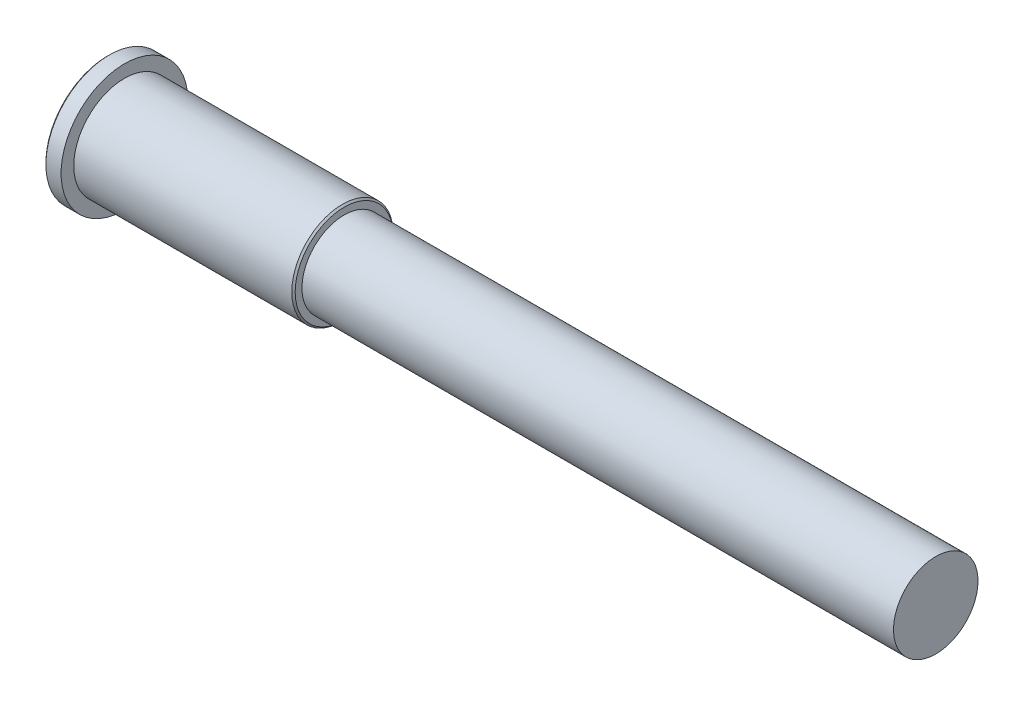
ISO-10303-21;
HEADER;
FILE_DESCRIPTION(('STEP AP214'),'2;1');
FILE_NAME('part.step','',(''),(''),'','','');
FILE_SCHEMA(('AUTOMOTIVE_DESIGN { 1 0 10303 214 1 1 1 1 }'));
ENDSEC;
DATA;
#1=APPLICATION_CONTEXT('core data for automotive mechanical design processes');
#2=APPLICATION_PROTOCOL_DEFINITION('international standard','automotive_design',2000,#1);
#3=PRODUCT_CONTEXT('',#1,'mechanical');
#4=PRODUCT('Part','Part','',(#3));
#5=PRODUCT_RELATED_PRODUCT_CATEGORY('part','',(#4));
#6=PRODUCT_DEFINITION_FORMATION('','',#4);
#7=PRODUCT_DEFINITION_CONTEXT('part definition',#1,'design');
#8=PRODUCT_DEFINITION('design','',#6,#7);
#9=PRODUCT_DEFINITION_SHAPE('','',#8);
#10=(LENGTH_UNIT() NAMED_UNIT(*) SI_UNIT(.MILLI.,.METRE.));
#11=(NAMED_UNIT(*) PLANE_ANGLE_UNIT() SI_UNIT($,.RADIAN.));
#12=(NAMED_UNIT(*) SI_UNIT($,.STERADIAN.) SOLID_ANGLE_UNIT());
#13=UNCERTAINTY_MEASURE_WITH_UNIT(LENGTH_MEASURE(1.E-05),#10,'distance_accuracy_value','');
#14=(GEOMETRIC_REPRESENTATION_CONTEXT(3) GLOBAL_UNCERTAINTY_ASSIGNED_CONTEXT((#13)) GLOBAL_UNIT_ASSIGNED_CONTEXT((#10,
#11,#12)) REPRESENTATION_CONTEXT('',''));
#15=CARTESIAN_POINT('',(0.,0.,0.));
#16=DIRECTION('',(0.,0.,1.));
#17=DIRECTION('',(1.,0.,0.));
#18=AXIS2_PLACEMENT_3D('',#15,#16,#17);
#19=CARTESIAN_POINT('',(2.,0.,0.));
#20=DIRECTION('',(-1.,0.,0.));
#21=DIRECTION('',(0.,0.,1.));
#22=AXIS2_PLACEMENT_3D('',#19,#20,#21);
#23=CYLINDRICAL_SURFACE('',#22,7.5);
#24=CARTESIAN_POINT('',(0.2,0.,0.));
#25=DIRECTION('',(1.,0.,0.));
#26=DIRECTION('',(0.,0.,-1.));
#27=AXIS2_PLACEMENT_3D('',#24,#25,#26);
#28=CIRCLE('',#27,7.5);
#29=CARTESIAN_POINT('',(0.2,0.,-7.5));
#30=VERTEX_POINT('',#29);
#31=EDGE_CURVE('E52',#30,#30,#28,.T.);
#32=ORIENTED_EDGE('',*,*,#31,.T.);
#33=EDGE_LOOP('',(#32));
#34=FACE_BOUND('',#33,.T.);
#35=CARTESIAN_POINT('',(2.,0.,0.));
#36=DIRECTION('',(1.,0.,0.));
#37=DIRECTION('',(0.,0.,-1.));
#38=AXIS2_PLACEMENT_3D('',#35,#36,#37);
#39=CIRCLE('',#38,7.5);
#40=CARTESIAN_POINT('',(2.,0.,-7.5));
#41=VERTEX_POINT('',#40);
#42=EDGE_CURVE('E58',#41,#41,#39,.T.);
#43=ORIENTED_EDGE('',*,*,#42,.F.);
#44=EDGE_LOOP('',(#43));
#45=FACE_BOUND('',#44,.T.);
#46=ADVANCED_FACE('F36',(#34,#45),#23,.T.);
#47=CARTESIAN_POINT('',(2.,0.,0.));
#48=DIRECTION('',(1.,0.,0.));
#49=DIRECTION('',(0.,0.,-1.));
#50=AXIS2_PLACEMENT_3D('',#47,#48,#49);
#51=PLANE('',#50);
#52=CARTESIAN_POINT('',(2.,0.,0.));
#53=DIRECTION('',(1.,0.,0.));
#54=DIRECTION('',(0.,0.,-1.));
#55=AXIS2_PLACEMENT_3D('',#52,#53,#54);
#56=CIRCLE('',#55,6.);
#57=CARTESIAN_POINT('',(2.,0.,6.));
#58=VERTEX_POINT('',#57);
#59=EDGE_CURVE('E61',#58,#58,#56,.T.);
#60=ORIENTED_EDGE('',*,*,#59,.F.);
#61=EDGE_LOOP('',(#60));
#62=FACE_BOUND('',#61,.T.);
#63=ORIENTED_EDGE('',*,*,#42,.T.);
#64=EDGE_LOOP('',(#63));
#65=FACE_BOUND('',#64,.T.);
#66=ADVANCED_FACE('F88',(#62,#65),#51,.T.);
#67=CARTESIAN_POINT('',(0.,0.,0.));
#68=DIRECTION('',(1.,0.,0.));
#69=DIRECTION('',(0.,0.,-1.));
#70=AXIS2_PLACEMENT_3D('',#67,#68,#69);
#71=PLANE('',#70);
#72=CARTESIAN_POINT('',(0.,0.,0.));
#73=DIRECTION('',(1.,0.,0.));
#74=DIRECTION('',(0.,0.,-1.));
#75=AXIS2_PLACEMENT_3D('',#72,#73,#74);
#76=CIRCLE('',#75,7.3);
#77=CARTESIAN_POINT('',(0.,0.,-7.3));
#78=VERTEX_POINT('',#77);
#79=EDGE_CURVE('E48',#78,#78,#76,.F.);
#80=ORIENTED_EDGE('',*,*,#79,.T.);
#81=EDGE_LOOP('',(#80));
#82=FACE_BOUND('',#81,.T.);
#83=ADVANCED_FACE('F85',(#82),#71,.F.);
#84=CARTESIAN_POINT('',(28.,0.,0.));
#85=DIRECTION('',(-1.,0.,0.));
#86=DIRECTION('',(0.,0.,1.));
#87=AXIS2_PLACEMENT_3D('',#84,#85,#86);
#88=CYLINDRICAL_SURFACE('',#87,6.);
#89=CARTESIAN_POINT('',(27.8000000000001,0.,0.));
#90=DIRECTION('',(1.,0.,0.));
#91=DIRECTION('',(0.,0.,-1.));
#92=AXIS2_PLACEMENT_3D('',#89,#90,#91);
#93=CIRCLE('',#92,6.);
#94=CARTESIAN_POINT('',(27.8000000000001,0.,6.));
#95=VERTEX_POINT('',#94);
#96=EDGE_CURVE('E10',#95,#95,#93,.F.);
#97=CARTESIAN_POINT('',(27.8000000000001,0.,6.));
#98=CARTESIAN_POINT('',(27.5312500000001,0.,6.));
#99=CARTESIAN_POINT('',(27.2625000000001,0.,6.));
#100=CARTESIAN_POINT('',(26.7250000000001,0.,6.));
#101=CARTESIAN_POINT('',(26.4562500000001,0.,6.));
#102=CARTESIAN_POINT('',(25.9187500000001,0.,6.));
#103=CARTESIAN_POINT('',(25.6500000000001,0.,6.));
#104=CARTESIAN_POINT('',(25.1125000000001,0.,6.));
#105=CARTESIAN_POINT('',(24.8437500000001,0.,6.));
#106=CARTESIAN_POINT('',(24.3062500000001,0.,6.));
#107=CARTESIAN_POINT('',(24.0375000000001,0.,6.));
#108=CARTESIAN_POINT('',(23.5000000000001,0.,6.));
#109=CARTESIAN_POINT('',(23.2312500000001,0.,6.));
#110=CARTESIAN_POINT('',(22.6937500000001,0.,6.));
#111=CARTESIAN_POINT('',(22.4250000000001,0.,6.));
#112=CARTESIAN_POINT('',(21.8875000000001,0.,6.));
#113=CARTESIAN_POINT('',(21.6187500000001,0.,6.));
#114=CARTESIAN_POINT('',(21.0812500000001,0.,6.));
#115=CARTESIAN_POINT('',(20.8125000000001,0.,6.));
#116=CARTESIAN_POINT('',(20.275,0.,6.));
#117=CARTESIAN_POINT('',(20.0062500000001,0.,6.));
#118=CARTESIAN_POINT('',(19.46875,0.,6.));
#119=CARTESIAN_POINT('',(19.2,0.,6.));
#120=CARTESIAN_POINT('',(18.6625,0.,6.));
#121=CARTESIAN_POINT('',(18.39375,0.,6.));
#122=CARTESIAN_POINT('',(17.85625,0.,6.));
#123=CARTESIAN_POINT('',(17.5875,0.,6.));
#124=CARTESIAN_POINT('',(17.05,0.,6.));
#125=CARTESIAN_POINT('',(16.78125,0.,6.));
#126=CARTESIAN_POINT('',(16.24375,0.,6.));
#127=CARTESIAN_POINT('',(15.975,0.,6.));
#128=CARTESIAN_POINT('',(15.4375,0.,6.));
#129=CARTESIAN_POINT('',(15.16875,0.,6.));
#130=CARTESIAN_POINT('',(14.63125,0.,6.));
#131=CARTESIAN_POINT('',(14.3625,0.,6.));
#132=CARTESIAN_POINT('',(13.825,0.,6.));
#133=CARTESIAN_POINT('',(13.55625,0.,6.));
#134=CARTESIAN_POINT('',(13.01875,0.,6.));
#135=CARTESIAN_POINT('',(12.75,0.,6.));
#136=CARTESIAN_POINT('',(12.2125,0.,6.));
#137=CARTESIAN_POINT('',(11.94375,0.,6.));
#138=CARTESIAN_POINT('',(11.40625,0.,6.));
#139=CARTESIAN_POINT('',(11.1375,0.,6.));
#140=CARTESIAN_POINT('',(10.6,0.,6.));
#141=CARTESIAN_POINT('',(10.33125,0.,6.));
#142=CARTESIAN_POINT('',(9.79375000000002,0.,6.));
#143=CARTESIAN_POINT('',(9.52500000000002,0.,6.));
#144=CARTESIAN_POINT('',(8.98750000000002,0.,6.));
#145=CARTESIAN_POINT('',(8.71875000000002,0.,6.));
#146=CARTESIAN_POINT('',(8.18125000000002,0.,6.));
#147=CARTESIAN_POINT('',(7.91250000000001,0.,6.));
#148=CARTESIAN_POINT('',(7.37500000000001,0.,6.));
#149=CARTESIAN_POINT('',(7.10625000000001,0.,6.));
#150=CARTESIAN_POINT('',(6.56875000000001,0.,6.));
#151=CARTESIAN_POINT('',(6.30000000000001,0.,6.));
#152=CARTESIAN_POINT('',(5.76250000000001,0.,6.));
#153=CARTESIAN_POINT('',(5.49375000000001,0.,6.));
#154=CARTESIAN_POINT('',(4.95625000000001,0.,6.));
#155=CARTESIAN_POINT('',(4.68750000000001,0.,6.));
#156=CARTESIAN_POINT('',(4.15000000000001,0.,6.));
#157=CARTESIAN_POINT('',(3.88125,0.,6.));
#158=CARTESIAN_POINT('',(3.34375,0.,6.));
#159=CARTESIAN_POINT('',(3.075,0.,6.));
#160=CARTESIAN_POINT('',(2.5375,0.,6.));
#161=CARTESIAN_POINT('',(2.26875,0.,6.));
#162=CARTESIAN_POINT('',(2.,0.,6.));
#163=B_SPLINE_CURVE_WITH_KNOTS('',3,(#97,#98,#99,#100,#101,#102,#103,#104,#105,#106,#107,#108,
#109,#110,#111,#112,#113,#114,#115,#116,#117,#118,#119,#120,#121,#122,#123,#124,#125,#126,#127,
#128,#129,#130,#131,#132,#133,#134,#135,#136,#137,#138,#139,#140,#141,#142,#143,#144,#145,#146,
#147,#148,#149,#150,#151,#152,#153,#154,#155,#156,#157,#158,#159,#160,#161,#162),.UNSPECIFIED.,
.F.,.F.,(4,2,2,2,2,2,2,2,2,2,2,2,2,2,2,2,2,2,2,2,2,2,2,2,2,2,2,2,2,2,2,2,4),(0.,
0.806250000000001,1.6125,2.41875,3.22500000000001,4.03125000000001,4.83750000000001,
5.64375000000001,6.45000000000001,7.25625000000002,8.06250000000002,8.86875000000002,
9.67500000000003,10.48125,11.2875,12.09375,12.9,13.70625,14.5125,15.31875,16.125,16.93125,
17.7375,18.54375,19.3500000000001,20.1562500000001,20.9625000000001,21.7687500000001,
22.5750000000001,23.3812500000001,24.1875000000001,24.9937500000001,25.8000000000001),.UNSPECIFIED.);
#164=EDGE_CURVE('BSEAM80',#95,#58,#163,.T.);
#165=ORIENTED_EDGE('',*,*,#96,.T.);
#166=ORIENTED_EDGE('',*,*,#59,.T.);
#167=ORIENTED_EDGE('',*,*,#164,.T.);
#168=ORIENTED_EDGE('',*,*,#164,.F.);
#169=EDGE_LOOP('',(#165,#167,#166,#168));
#170=FACE_BOUND('',#169,.T.);
#171=ADVANCED_FACE('F80',(#170),#88,.T.);
#172=CARTESIAN_POINT('',(28.,0.,0.));
#173=DIRECTION('',(1.,0.,0.));
#174=DIRECTION('',(0.,0.,-1.));
#175=AXIS2_PLACEMENT_3D('',#172,#173,#174);
#176=PLANE('',#175);
#177=CARTESIAN_POINT('',(28.,0.,0.));
#178=DIRECTION('',(1.,0.,0.));
#179=DIRECTION('',(0.,0.,-1.));
#180=AXIS2_PLACEMENT_3D('',#177,#178,#179);
#181=CIRCLE('',#180,5.80000000000007);
#182=CARTESIAN_POINT('',(28.,0.,5.80000000000007));
#183=VERTEX_POINT('',#182);
#184=EDGE_CURVE('E44',#183,#183,#181,.T.);
#185=ORIENTED_EDGE('',*,*,#184,.T.);
#186=EDGE_LOOP('',(#185));
#187=FACE_BOUND('',#186,.T.);
#188=CARTESIAN_POINT('',(28.,0.,0.));
#189=DIRECTION('',(1.,0.,0.));
#190=DIRECTION('',(0.,0.,-1.));
#191=AXIS2_PLACEMENT_3D('',#188,#189,#190);
#192=CIRCLE('',#191,5.);
#193=CARTESIAN_POINT('',(28.,0.,-5.));
#194=VERTEX_POINT('',#193);
#195=EDGE_CURVE('E57',#194,#194,#192,.T.);
#196=ORIENTED_EDGE('',*,*,#195,.F.);
#197=EDGE_LOOP('',(#196));
#198=FACE_BOUND('',#197,.T.);
#199=ADVANCED_FACE('F75',(#187,#198),#176,.T.);
#200=CARTESIAN_POINT('',(98.,0.,0.));
#201=DIRECTION('',(-1.,0.,0.));
#202=DIRECTION('',(0.,0.,1.));
#203=AXIS2_PLACEMENT_3D('',#200,#201,#202);
#204=CYLINDRICAL_SURFACE('',#203,5.);
#205=CARTESIAN_POINT('',(98.,0.,0.));
#206=DIRECTION('',(1.,0.,0.));
#207=DIRECTION('',(0.,0.,-1.));
#208=AXIS2_PLACEMENT_3D('',#205,#206,#207);
#209=CIRCLE('',#208,5.);
#210=CARTESIAN_POINT('',(98.,0.,-5.));
#211=VERTEX_POINT('',#210);
#212=EDGE_CURVE('E62',#211,#211,#209,.T.);
#213=ORIENTED_EDGE('',*,*,#212,.F.);
#214=EDGE_LOOP('',(#213));
#215=FACE_BOUND('',#214,.T.);
#216=ORIENTED_EDGE('',*,*,#195,.T.);
#217=EDGE_LOOP('',(#216));
#218=FACE_BOUND('',#217,.T.);
#219=ADVANCED_FACE('F72',(#215,#218),#204,.T.);
#220=CARTESIAN_POINT('',(98.,0.,0.));
#221=DIRECTION('',(1.,0.,0.));
#222=DIRECTION('',(0.,0.,-1.));
#223=AXIS2_PLACEMENT_3D('',#220,#221,#222);
#224=PLANE('',#223);
#225=ORIENTED_EDGE('',*,*,#212,.T.);
#226=EDGE_LOOP('',(#225));
#227=FACE_BOUND('',#226,.T.);
#228=ADVANCED_FACE('F70',(#227),#224,.T.);
#229=CARTESIAN_POINT('',(0.2,0.,0.));
#230=DIRECTION('',(1.,0.,0.));
#231=DIRECTION('',(0.,0.,-1.));
#232=AXIS2_PLACEMENT_3D('',#229,#230,#231);
#233=CONICAL_SURFACE('',#232,7.5,0.785398163397444);
#234=CARTESIAN_POINT('',(0.,0.,-7.3));
#235=CARTESIAN_POINT('',(0.00208333333333309,0.,-7.30208333333334));
#236=CARTESIAN_POINT('',(0.00416666666666649,0.,-7.30416666666667));
#237=CARTESIAN_POINT('',(0.00833333333333329,0.,-7.30833333333334));
#238=CARTESIAN_POINT('',(0.0104166666666667,0.,-7.31041666666667));
#239=CARTESIAN_POINT('',(0.0145833333333334,0.,-7.31458333333333));
#240=CARTESIAN_POINT('',(0.0166666666666666,0.,-7.31666666666667));
#241=CARTESIAN_POINT('',(0.0208333333333333,0.,-7.32083333333333));
#242=CARTESIAN_POINT('',(0.0229166666666666,0.,-7.32291666666667));
#243=CARTESIAN_POINT('',(0.0270833333333332,0.,-7.32708333333334));
#244=CARTESIAN_POINT('',(0.0291666666666665,0.,-7.32916666666667));
#245=CARTESIAN_POINT('',(0.0333333333333332,0.,-7.33333333333333));
#246=CARTESIAN_POINT('',(0.0354166666666666,0.,-7.33541666666667));
#247=CARTESIAN_POINT('',(0.0395833333333333,0.,-7.33958333333333));
#248=CARTESIAN_POINT('',(0.0416666666666666,0.,-7.34166666666667));
#249=CARTESIAN_POINT('',(0.0458333333333332,0.,-7.34583333333333));
#250=CARTESIAN_POINT('',(0.0479166666666665,0.,-7.34791666666667));
#251=CARTESIAN_POINT('',(0.0520833333333332,0.,-7.35208333333333));
#252=CARTESIAN_POINT('',(0.0541666666666666,0.,-7.35416666666667));
#253=CARTESIAN_POINT('',(0.0583333333333333,0.,-7.35833333333333));
#254=CARTESIAN_POINT('',(0.0604166666666665,0.,-7.36041666666667));
#255=CARTESIAN_POINT('',(0.0645833333333332,0.,-7.36458333333333));
#256=CARTESIAN_POINT('',(0.0666666666666666,0.,-7.36666666666667));
#257=CARTESIAN_POINT('',(0.0708333333333332,0.,-7.37083333333333));
#258=CARTESIAN_POINT('',(0.0729166666666664,0.,-7.37291666666667));
#259=CARTESIAN_POINT('',(0.0770833333333331,0.,-7.37708333333333));
#260=CARTESIAN_POINT('',(0.0791666666666666,0.,-7.37916666666667));
#261=CARTESIAN_POINT('',(0.0833333333333333,0.,-7.38333333333333));
#262=CARTESIAN_POINT('',(0.0854166666666665,0.,-7.38541666666667));
#263=CARTESIAN_POINT('',(0.0895833333333331,0.,-7.38958333333333));
#264=CARTESIAN_POINT('',(0.0916666666666664,0.,-7.39166666666667));
#265=CARTESIAN_POINT('',(0.0958333333333331,0.,-7.39583333333333));
#266=CARTESIAN_POINT('',(0.0979166666666665,0.,-7.39791666666667));
#267=CARTESIAN_POINT('',(0.102083333333333,0.,-7.40208333333333));
#268=CARTESIAN_POINT('',(0.104166666666666,0.,-7.40416666666667));
#269=CARTESIAN_POINT('',(0.108333333333333,0.,-7.40833333333333));
#270=CARTESIAN_POINT('',(0.110416666666666,0.,-7.41041666666667));
#271=CARTESIAN_POINT('',(0.114583333333333,0.,-7.41458333333333));
#272=CARTESIAN_POINT('',(0.116666666666666,0.,-7.41666666666667));
#273=CARTESIAN_POINT('',(0.120833333333333,0.,-7.42083333333333));
#274=CARTESIAN_POINT('',(0.122916666666667,0.,-7.42291666666667));
#275=CARTESIAN_POINT('',(0.127083333333333,0.,-7.42708333333333));
#276=CARTESIAN_POINT('',(0.129166666666666,0.,-7.42916666666667));
#277=CARTESIAN_POINT('',(0.133333333333333,0.,-7.43333333333333));
#278=CARTESIAN_POINT('',(0.135416666666666,0.,-7.43541666666667));
#279=CARTESIAN_POINT('',(0.139583333333333,0.,-7.43958333333333));
#280=CARTESIAN_POINT('',(0.141666666666666,0.,-7.44166666666667));
#281=CARTESIAN_POINT('',(0.145833333333333,0.,-7.44583333333333));
#282=CARTESIAN_POINT('',(0.147916666666666,0.,-7.44791666666667));
#283=CARTESIAN_POINT('',(0.152083333333333,0.,-7.45208333333333));
#284=CARTESIAN_POINT('',(0.154166666666666,0.,-7.45416666666667));
#285=CARTESIAN_POINT('',(0.158333333333333,0.,-7.45833333333333));
#286=CARTESIAN_POINT('',(0.160416666666666,0.,-7.46041666666667));
#287=CARTESIAN_POINT('',(0.164583333333333,0.,-7.46458333333333));
#288=CARTESIAN_POINT('',(0.166666666666666,0.,-7.46666666666667));
#289=CARTESIAN_POINT('',(0.170833333333333,0.,-7.47083333333333));
#290=CARTESIAN_POINT('',(0.172916666666666,0.,-7.47291666666667));
#291=CARTESIAN_POINT('',(0.177083333333333,0.,-7.47708333333333));
#292=CARTESIAN_POINT('',(0.179166666666666,0.,-7.47916666666667));
#293=CARTESIAN_POINT('',(0.183333333333333,0.,-7.48333333333333));
#294=CARTESIAN_POINT('',(0.185416666666666,0.,-7.48541666666667));
#295=CARTESIAN_POINT('',(0.189583333333333,0.,-7.48958333333333));
#296=CARTESIAN_POINT('',(0.191666666666666,0.,-7.49166666666667));
#297=CARTESIAN_POINT('',(0.195833333333333,0.,-7.49583333333333));
#298=CARTESIAN_POINT('',(0.197916666666667,0.,-7.49791666666667));
#299=CARTESIAN_POINT('',(0.2,0.,-7.5));
#300=B_SPLINE_CURVE_WITH_KNOTS('',3,(#234,#235,#236,#237,#238,#239,#240,#241,#242,#243,#244,
#245,#246,#247,#248,#249,#250,#251,#252,#253,#254,#255,#256,#257,#258,#259,#260,#261,#262,#263,
#264,#265,#266,#267,#268,#269,#270,#271,#272,#273,#274,#275,#276,#277,#278,#279,#280,#281,#282,
#283,#284,#285,#286,#287,#288,#289,#290,#291,#292,#293,#294,#295,#296,#297,#298,#299),
.UNSPECIFIED.,.F.,.F.,(4,2,2,2,2,2,2,2,2,2,2,2,2,2,2,2,2,2,2,2,2,2,2,2,2,2,2,2,2,2,2,2,4),(0.,
0.00883883476483196,0.0176776695296633,0.0265165042944953,0.0353553390593272,0.0441941738241592,
0.0530330085889906,0.0618718433538225,0.0707106781186545,0.0795495128834858,0.0883883476483178,
0.0972271824131498,0.106066017177982,0.114904851942813,0.123743686707645,0.132582521472477,
0.141421356237308,0.15026019100214,0.159099025766972,0.167937860531804,0.176776695296636,
0.185615530061468,0.1944543648263,0.203293199591131,0.212132034355963,0.220970869120795,
0.229809703885627,0.238648538650458,0.24748737341529,0.256326208180122,0.265165042944954,
0.274003877709785,0.282842712474617),.UNSPECIFIED.);
#301=EDGE_CURVE('BSEAM99',#78,#30,#300,.T.);
#302=ORIENTED_EDGE('',*,*,#79,.F.);
#303=ORIENTED_EDGE('',*,*,#31,.F.);
#304=ORIENTED_EDGE('',*,*,#301,.T.);
#305=ORIENTED_EDGE('',*,*,#301,.F.);
#306=EDGE_LOOP('',(#302,#304,#303,#305));
#307=FACE_BOUND('',#306,.T.);
#308=ADVANCED_FACE('F99',(#307),#233,.T.);
#309=CARTESIAN_POINT('',(28.,0.,0.));
#310=DIRECTION('',(-1.,0.,0.));
#311=DIRECTION('',(0.,0.,1.));
#312=AXIS2_PLACEMENT_3D('',#309,#310,#311);
#313=CONICAL_SURFACE('',#312,5.80000000000007,0.785398163397474);
#314=CARTESIAN_POINT('',(27.8000000000001,0.,6.));
#315=CARTESIAN_POINT('',(27.8020833333334,0.,5.99791666666667));
#316=CARTESIAN_POINT('',(27.8041666666667,0.,5.99583333333334));
#317=CARTESIAN_POINT('',(27.8083333333334,0.,5.99166666666667));
#318=CARTESIAN_POINT('',(27.8104166666667,0.,5.98958333333334));
#319=CARTESIAN_POINT('',(27.8145833333334,0.,5.98541666666667));
#320=CARTESIAN_POINT('',(27.8166666666667,0.,5.98333333333334));
#321=CARTESIAN_POINT('',(27.8208333333334,0.,5.97916666666668));
#322=CARTESIAN_POINT('',(27.8229166666667,0.,5.97708333333334));
#323=CARTESIAN_POINT('',(27.8270833333334,0.,5.97291666666668));
#324=CARTESIAN_POINT('',(27.8291666666667,0.,5.97083333333335));
#325=CARTESIAN_POINT('',(27.8333333333334,0.,5.96666666666668));
#326=CARTESIAN_POINT('',(27.8354166666667,0.,5.96458333333335));
#327=CARTESIAN_POINT('',(27.8395833333334,0.,5.96041666666668));
#328=CARTESIAN_POINT('',(27.8416666666667,0.,5.95833333333335));
#329=CARTESIAN_POINT('',(27.8458333333334,0.,5.95416666666669));
#330=CARTESIAN_POINT('',(27.8479166666667,0.,5.95208333333335));
#331=CARTESIAN_POINT('',(27.8520833333334,0.,5.94791666666669));
#332=CARTESIAN_POINT('',(27.8541666666667,0.,5.94583333333336));
#333=CARTESIAN_POINT('',(27.8583333333334,0.,5.94166666666669));
#334=CARTESIAN_POINT('',(27.8604166666667,0.,5.93958333333336));
#335=CARTESIAN_POINT('',(27.8645833333334,0.,5.93541666666669));
#336=CARTESIAN_POINT('',(27.8666666666667,0.,5.93333333333336));
#337=CARTESIAN_POINT('',(27.8708333333334,0.,5.92916666666669));
#338=CARTESIAN_POINT('',(27.8729166666667,0.,5.92708333333336));
#339=CARTESIAN_POINT('',(27.8770833333334,0.,5.9229166666667));
#340=CARTESIAN_POINT('',(27.8791666666667,0.,5.92083333333336));
#341=CARTESIAN_POINT('',(27.8833333333334,0.,5.9166666666667));
#342=CARTESIAN_POINT('',(27.8854166666667,0.,5.91458333333336));
#343=CARTESIAN_POINT('',(27.8895833333334,0.,5.9104166666667));
#344=CARTESIAN_POINT('',(27.8916666666667,0.,5.90833333333337));
#345=CARTESIAN_POINT('',(27.8958333333334,0.,5.9041666666667));
#346=CARTESIAN_POINT('',(27.8979166666667,0.,5.90208333333337));
#347=CARTESIAN_POINT('',(27.9020833333334,0.,5.8979166666667));
#348=CARTESIAN_POINT('',(27.9041666666667,0.,5.89583333333337));
#349=CARTESIAN_POINT('',(27.9083333333334,0.,5.89166666666671));
#350=CARTESIAN_POINT('',(27.9104166666667,0.,5.88958333333337));
#351=CARTESIAN_POINT('',(27.9145833333334,0.,5.88541666666671));
#352=CARTESIAN_POINT('',(27.9166666666667,0.,5.88333333333338));
#353=CARTESIAN_POINT('',(27.9208333333334,0.,5.87916666666671));
#354=CARTESIAN_POINT('',(27.9229166666667,0.,5.87708333333338));
#355=CARTESIAN_POINT('',(27.9270833333334,0.,5.87291666666671));
#356=CARTESIAN_POINT('',(27.9291666666667,0.,5.87083333333338));
#357=CARTESIAN_POINT('',(27.9333333333334,0.,5.86666666666671));
#358=CARTESIAN_POINT('',(27.9354166666667,0.,5.86458333333338));
#359=CARTESIAN_POINT('',(27.9395833333334,0.,5.86041666666672));
#360=CARTESIAN_POINT('',(27.9416666666667,0.,5.85833333333338));
#361=CARTESIAN_POINT('',(27.9458333333334,0.,5.85416666666672));
#362=CARTESIAN_POINT('',(27.9479166666667,0.,5.85208333333339));
#363=CARTESIAN_POINT('',(27.9520833333333,0.,5.84791666666672));
#364=CARTESIAN_POINT('',(27.9541666666667,0.,5.84583333333339));
#365=CARTESIAN_POINT('',(27.9583333333333,0.,5.84166666666672));
#366=CARTESIAN_POINT('',(27.9604166666667,0.,5.83958333333339));
#367=CARTESIAN_POINT('',(27.9645833333333,0.,5.83541666666672));
#368=CARTESIAN_POINT('',(27.9666666666667,0.,5.83333333333339));
#369=CARTESIAN_POINT('',(27.9708333333333,0.,5.82916666666673));
#370=CARTESIAN_POINT('',(27.9729166666667,0.,5.82708333333339));
#371=CARTESIAN_POINT('',(27.9770833333333,0.,5.82291666666673));
#372=CARTESIAN_POINT('',(27.9791666666667,0.,5.8208333333334));
#373=CARTESIAN_POINT('',(27.9833333333333,0.,5.81666666666673));
#374=CARTESIAN_POINT('',(27.9854166666667,0.,5.8145833333334));
#375=CARTESIAN_POINT('',(27.9895833333333,0.,5.81041666666673));
#376=CARTESIAN_POINT('',(27.9916666666667,0.,5.8083333333334));
#377=CARTESIAN_POINT('',(27.9958333333333,0.,5.80416666666673));
#378=CARTESIAN_POINT('',(27.9979166666667,0.,5.8020833333334));
#379=CARTESIAN_POINT('',(28.,0.,5.80000000000007));
#380=B_SPLINE_CURVE_WITH_KNOTS('',3,(#314,#315,#316,#317,#318,#319,#320,#321,#322,#323,#324,
#325,#326,#327,#328,#329,#330,#331,#332,#333,#334,#335,#336,#337,#338,#339,#340,#341,#342,#343,
#344,#345,#346,#347,#348,#349,#350,#351,#352,#353,#354,#355,#356,#357,#358,#359,#360,#361,#362,
#363,#364,#365,#366,#367,#368,#369,#370,#371,#372,#373,#374,#375,#376,#377,#378,#379),
.UNSPECIFIED.,.F.,.F.,(4,2,2,2,2,2,2,2,2,2,2,2,2,2,2,2,2,2,2,2,2,2,2,2,2,2,2,2,2,2,2,2,4),(0.,
0.00883883476482964,0.0176776695296574,0.0265165042944871,0.0353553390593143,0.0441941738241445,
0.0530330085889717,0.061871843353802,0.0707106781186292,0.0795495128834588,0.0883883476482866,
0.0972271824131163,0.106066017177946,0.114904851942774,0.123743686707601,0.132582521472431,
0.141421356237258,0.150260191002088,0.159099025766916,0.167937860531745,0.176776695296573,
0.185615530061403,0.19445436482623,0.20329319959106,0.21213203435589,0.220970869120717,
0.229809703885547,0.238648538650375,0.247487373415205,0.256326208180032,0.265165042944862,
0.274003877709689,0.282842712474519),.UNSPECIFIED.);
#381=EDGE_CURVE('BSEAM39',#95,#183,#380,.T.);
#382=ORIENTED_EDGE('',*,*,#96,.F.);
#383=ORIENTED_EDGE('',*,*,#184,.F.);
#384=ORIENTED_EDGE('',*,*,#381,.T.);
#385=ORIENTED_EDGE('',*,*,#381,.F.);
#386=EDGE_LOOP('',(#382,#384,#383,#385));
#387=FACE_BOUND('',#386,.T.);
#388=ADVANCED_FACE('F39',(#387),#313,.T.);
#389=CLOSED_SHELL('',(#46,#66,#83,#171,#199,#219,#228,#308,#388));
#390=MANIFOLD_SOLID_BREP('B2',#389);
#391=ADVANCED_BREP_SHAPE_REPRESENTATION('',(#18,#390),#14);
#392=SHAPE_DEFINITION_REPRESENTATION(#9,#391);
ENDSEC;
END-ISO-10303-21;
